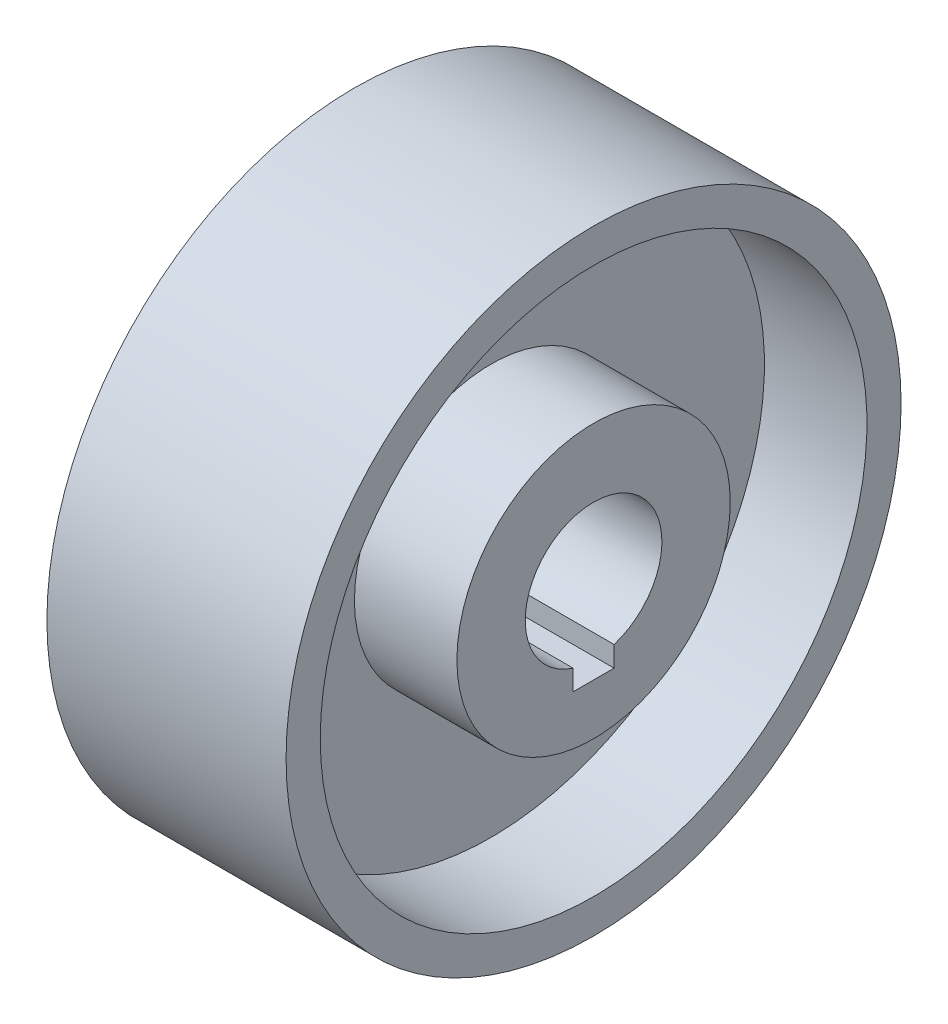
ISO-10303-21;
HEADER;
FILE_DESCRIPTION(('STEP AP214'),'2;1');
FILE_NAME('part.step','',(''),(''),'','','');
FILE_SCHEMA(('AUTOMOTIVE_DESIGN { 1 0 10303 214 1 1 1 1 }'));
ENDSEC;
DATA;
#1=APPLICATION_CONTEXT('core data for automotive mechanical design processes');
#2=APPLICATION_PROTOCOL_DEFINITION('international standard','automotive_design',2000,#1);
#3=PRODUCT_CONTEXT('',#1,'mechanical');
#4=PRODUCT('Part','Part','',(#3));
#5=PRODUCT_RELATED_PRODUCT_CATEGORY('part','',(#4));
#6=PRODUCT_DEFINITION_FORMATION('','',#4);
#7=PRODUCT_DEFINITION_CONTEXT('part definition',#1,'design');
#8=PRODUCT_DEFINITION('design','',#6,#7);
#9=PRODUCT_DEFINITION_SHAPE('','',#8);
#10=(LENGTH_UNIT() NAMED_UNIT(*) SI_UNIT(.MILLI.,.METRE.));
#11=(NAMED_UNIT(*) PLANE_ANGLE_UNIT() SI_UNIT($,.RADIAN.));
#12=(NAMED_UNIT(*) SI_UNIT($,.STERADIAN.) SOLID_ANGLE_UNIT());
#13=UNCERTAINTY_MEASURE_WITH_UNIT(LENGTH_MEASURE(1.E-05),#10,'distance_accuracy_value','');
#14=(GEOMETRIC_REPRESENTATION_CONTEXT(3) GLOBAL_UNCERTAINTY_ASSIGNED_CONTEXT((#13)) GLOBAL_UNIT_ASSIGNED_CONTEXT((#10,
#11,#12)) REPRESENTATION_CONTEXT('',''));
#15=CARTESIAN_POINT('',(0.,0.,0.));
#16=DIRECTION('',(0.,0.,1.));
#17=DIRECTION('',(1.,0.,0.));
#18=AXIS2_PLACEMENT_3D('',#15,#16,#17);
#19=CARTESIAN_POINT('',(-17.5,0.,-45.));
#20=DIRECTION('',(1.,0.,0.));
#21=DIRECTION('',(0.,0.,-1.));
#22=AXIS2_PLACEMENT_3D('',#19,#20,#21);
#23=PLANE('',#22);
#24=CARTESIAN_POINT('',(-17.5,0.,0.));
#25=DIRECTION('',(-1.,0.,0.));
#26=DIRECTION('',(0.,0.,1.));
#27=AXIS2_PLACEMENT_3D('',#24,#25,#26);
#28=CIRCLE('',#27,40.);
#29=CARTESIAN_POINT('',(-17.5,0.,40.));
#30=VERTEX_POINT('',#29);
#31=EDGE_CURVE('E11',#30,#30,#28,.T.);
#32=ORIENTED_EDGE('',*,*,#31,.F.);
#33=EDGE_LOOP('',(#32));
#34=FACE_BOUND('',#33,.T.);
#35=CARTESIAN_POINT('',(-17.5,0.,0.));
#36=DIRECTION('',(-1.,0.,0.));
#37=DIRECTION('',(0.,0.,1.));
#38=AXIS2_PLACEMENT_3D('',#35,#36,#37);
#39=CIRCLE('',#38,45.);
#40=CARTESIAN_POINT('',(-17.5,0.,45.));
#41=VERTEX_POINT('',#40);
#42=EDGE_CURVE('E84',#41,#41,#39,.T.);
#43=ORIENTED_EDGE('',*,*,#42,.T.);
#44=EDGE_LOOP('',(#43));
#45=FACE_BOUND('',#44,.T.);
#46=ADVANCED_FACE('F37',(#34,#45),#23,.F.);
#47=CARTESIAN_POINT('',(-42.0698329260567,0.,0.));
#48=DIRECTION('',(-1.,0.,0.));
#49=DIRECTION('',(0.,0.,1.));
#50=AXIS2_PLACEMENT_3D('',#47,#48,#49);
#51=CYLINDRICAL_SURFACE('',#50,40.);
#52=CARTESIAN_POINT('',(-2.50000000000001,0.,0.));
#53=DIRECTION('',(-1.,0.,0.));
#54=DIRECTION('',(0.,0.,1.));
#55=AXIS2_PLACEMENT_3D('',#52,#53,#54);
#56=CIRCLE('',#55,40.);
#57=CARTESIAN_POINT('',(-2.50000000000001,0.,40.));
#58=VERTEX_POINT('',#57);
#59=EDGE_CURVE('E44',#58,#58,#56,.T.);
#60=ORIENTED_EDGE('',*,*,#59,.F.);
#61=EDGE_LOOP('',(#60));
#62=FACE_BOUND('',#61,.T.);
#63=ORIENTED_EDGE('',*,*,#31,.T.);
#64=EDGE_LOOP('',(#63));
#65=FACE_BOUND('',#64,.T.);
#66=ADVANCED_FACE('F113',(#62,#65),#51,.F.);
#67=CARTESIAN_POINT('',(-2.50000000000001,0.,-40.));
#68=DIRECTION('',(1.,0.,0.));
#69=DIRECTION('',(0.,0.,-1.));
#70=AXIS2_PLACEMENT_3D('',#67,#68,#69);
#71=PLANE('',#70);
#72=CARTESIAN_POINT('',(-2.5,0.,0.));
#73=DIRECTION('',(-1.,0.,0.));
#74=DIRECTION('',(0.,0.,1.));
#75=AXIS2_PLACEMENT_3D('',#72,#73,#74);
#76=CIRCLE('',#75,20.);
#77=CARTESIAN_POINT('',(-2.5,0.,20.));
#78=VERTEX_POINT('',#77);
#79=EDGE_CURVE('E101',#78,#78,#76,.T.);
#80=ORIENTED_EDGE('',*,*,#79,.F.);
#81=EDGE_LOOP('',(#80));
#82=FACE_BOUND('',#81,.T.);
#83=ORIENTED_EDGE('',*,*,#59,.T.);
#84=EDGE_LOOP('',(#83));
#85=FACE_BOUND('',#84,.T.);
#86=ADVANCED_FACE('F111',(#82,#85),#71,.F.);
#87=CARTESIAN_POINT('',(-42.0698329260567,0.,0.));
#88=DIRECTION('',(-1.,0.,0.));
#89=DIRECTION('',(0.,0.,1.));
#90=AXIS2_PLACEMENT_3D('',#87,#88,#89);
#91=CYLINDRICAL_SURFACE('',#90,20.);
#92=CARTESIAN_POINT('',(-17.5,0.,0.));
#93=DIRECTION('',(-1.,0.,0.));
#94=DIRECTION('',(0.,0.,1.));
#95=AXIS2_PLACEMENT_3D('',#92,#93,#94);
#96=CIRCLE('',#95,20.);
#97=CARTESIAN_POINT('',(-17.5,0.,20.));
#98=VERTEX_POINT('',#97);
#99=EDGE_CURVE('E98',#98,#98,#96,.T.);
#100=ORIENTED_EDGE('',*,*,#99,.F.);
#101=EDGE_LOOP('',(#100));
#102=FACE_BOUND('',#101,.T.);
#103=ORIENTED_EDGE('',*,*,#79,.T.);
#104=EDGE_LOOP('',(#103));
#105=FACE_BOUND('',#104,.T.);
#106=ADVANCED_FACE('F194',(#102,#105),#91,.T.);
#107=CARTESIAN_POINT('',(-17.5,0.,-20.));
#108=DIRECTION('',(1.,0.,0.));
#109=DIRECTION('',(0.,0.,-1.));
#110=AXIS2_PLACEMENT_3D('',#107,#108,#109);
#111=PLANE('',#110);
#112=DIRECTION('',(0.,0.,1.));
#113=VECTOR('',#112,1.);
#114=CARTESIAN_POINT('',(-17.5,-12.5393920141695,3.));
#115=LINE('',#114,#113);
#116=CARTESIAN_POINT('',(-17.5,-12.5393920141695,-3.));
#117=VERTEX_POINT('',#116);
#118=CARTESIAN_POINT('',(-17.5,-12.5393920141695,3.));
#119=VERTEX_POINT('',#118);
#120=EDGE_CURVE('E152',#117,#119,#115,.T.);
#121=ORIENTED_EDGE('',*,*,#120,.F.);
#122=DIRECTION('',(0.,-1.,0.));
#123=VECTOR('',#122,1.);
#124=CARTESIAN_POINT('',(-17.5,-12.5393920141695,-3.));
#125=LINE('',#124,#123);
#126=CARTESIAN_POINT('',(-17.5,-9.53939201416946,-3.));
#127=VERTEX_POINT('',#126);
#128=EDGE_CURVE('E97',#127,#117,#125,.T.);
#129=ORIENTED_EDGE('',*,*,#128,.F.);
#130=CARTESIAN_POINT('',(-17.5,0.,0.));
#131=DIRECTION('',(-1.,0.,0.));
#132=DIRECTION('',(0.,0.,1.));
#133=AXIS2_PLACEMENT_3D('',#130,#131,#132);
#134=CIRCLE('',#133,10.);
#135=CARTESIAN_POINT('',(-17.5,-9.53939201416946,3.));
#136=VERTEX_POINT('',#135);
#137=EDGE_CURVE('E90',#136,#127,#134,.T.);
#138=ORIENTED_EDGE('',*,*,#137,.F.);
#139=DIRECTION('',(0.,1.,0.));
#140=VECTOR('',#139,1.);
#141=CARTESIAN_POINT('',(-17.5,-9.53939201416946,3.));
#142=LINE('',#141,#140);
#143=EDGE_CURVE('E77',#119,#136,#142,.T.);
#144=ORIENTED_EDGE('',*,*,#143,.F.);
#145=EDGE_LOOP('',(#121,#129,#138,#144));
#146=FACE_BOUND('',#145,.T.);
#147=ORIENTED_EDGE('',*,*,#99,.T.);
#148=EDGE_LOOP('',(#147));
#149=FACE_BOUND('',#148,.T.);
#150=ADVANCED_FACE('F95',(#146,#149),#111,.F.);
#151=CARTESIAN_POINT('',(-42.0698329260567,0.,0.));
#152=DIRECTION('',(-1.,0.,0.));
#153=DIRECTION('',(0.,0.,1.));
#154=AXIS2_PLACEMENT_3D('',#151,#152,#153);
#155=CYLINDRICAL_SURFACE('',#154,10.);
#156=ORIENTED_EDGE('',*,*,#137,.T.);
#157=DIRECTION('',(1.,0.,0.));
#158=VECTOR('',#157,1.);
#159=CARTESIAN_POINT('',(-17.501,-9.53939201416946,-3.));
#160=LINE('',#159,#158);
#161=CARTESIAN_POINT('',(17.5,-9.53939201416946,-3.));
#162=VERTEX_POINT('',#161);
#163=EDGE_CURVE('E59',#127,#162,#160,.T.);
#164=ORIENTED_EDGE('',*,*,#163,.T.);
#165=CARTESIAN_POINT('',(17.5,0.,0.));
#166=DIRECTION('',(-1.,0.,0.));
#167=DIRECTION('',(0.,0.,1.));
#168=AXIS2_PLACEMENT_3D('',#165,#166,#167);
#169=CIRCLE('',#168,10.);
#170=CARTESIAN_POINT('',(17.5,-9.53939201416946,3.));
#171=VERTEX_POINT('',#170);
#172=EDGE_CURVE('E92',#171,#162,#169,.T.);
#173=ORIENTED_EDGE('',*,*,#172,.F.);
#174=DIRECTION('',(1.,0.,0.));
#175=VECTOR('',#174,1.);
#176=CARTESIAN_POINT('',(-17.501,-9.53939201416946,3.));
#177=LINE('',#176,#175);
#178=EDGE_CURVE('E51',#136,#171,#177,.T.);
#179=ORIENTED_EDGE('',*,*,#178,.F.);
#180=EDGE_LOOP('',(#156,#164,#173,#179));
#181=FACE_BOUND('',#180,.T.);
#182=ADVANCED_FACE('F89',(#181),#155,.F.);
#183=CARTESIAN_POINT('',(17.5,0.,-20.));
#184=DIRECTION('',(-1.,0.,0.));
#185=DIRECTION('',(0.,0.,1.));
#186=AXIS2_PLACEMENT_3D('',#183,#184,#185);
#187=PLANE('',#186);
#188=CARTESIAN_POINT('',(17.5,0.,0.));
#189=DIRECTION('',(-1.,0.,0.));
#190=DIRECTION('',(0.,0.,1.));
#191=AXIS2_PLACEMENT_3D('',#188,#189,#190);
#192=CIRCLE('',#191,20.);
#193=CARTESIAN_POINT('',(17.5,0.,20.));
#194=VERTEX_POINT('',#193);
#195=EDGE_CURVE('E103',#194,#194,#192,.T.);
#196=ORIENTED_EDGE('',*,*,#195,.F.);
#197=EDGE_LOOP('',(#196));
#198=FACE_BOUND('',#197,.T.);
#199=ORIENTED_EDGE('',*,*,#172,.T.);
#200=DIRECTION('',(0.,1.,0.));
#201=VECTOR('',#200,1.);
#202=CARTESIAN_POINT('',(17.5,-12.5393920141695,-3.));
#203=LINE('',#202,#201);
#204=CARTESIAN_POINT('',(17.5,-12.5393920141695,-3.));
#205=VERTEX_POINT('',#204);
#206=EDGE_CURVE('E93',#205,#162,#203,.T.);
#207=ORIENTED_EDGE('',*,*,#206,.F.);
#208=DIRECTION('',(0.,0.,-1.));
#209=VECTOR('',#208,1.);
#210=CARTESIAN_POINT('',(17.5,-12.5393920141695,3.));
#211=LINE('',#210,#209);
#212=CARTESIAN_POINT('',(17.5,-12.5393920141695,3.));
#213=VERTEX_POINT('',#212);
#214=EDGE_CURVE('E149',#213,#205,#211,.T.);
#215=ORIENTED_EDGE('',*,*,#214,.F.);
#216=DIRECTION('',(0.,-1.,0.));
#217=VECTOR('',#216,1.);
#218=CARTESIAN_POINT('',(17.5,-9.53939201416946,3.));
#219=LINE('',#218,#217);
#220=EDGE_CURVE('E147',#171,#213,#219,.T.);
#221=ORIENTED_EDGE('',*,*,#220,.F.);
#222=EDGE_LOOP('',(#199,#207,#215,#221));
#223=FACE_BOUND('',#222,.T.);
#224=ADVANCED_FACE('F141',(#198,#223),#187,.F.);
#225=CARTESIAN_POINT('',(-42.0698329260567,0.,0.));
#226=DIRECTION('',(-1.,0.,0.));
#227=DIRECTION('',(0.,0.,1.));
#228=AXIS2_PLACEMENT_3D('',#225,#226,#227);
#229=CYLINDRICAL_SURFACE('',#228,20.);
#230=CARTESIAN_POINT('',(2.5,0.,0.));
#231=DIRECTION('',(-1.,0.,0.));
#232=DIRECTION('',(0.,0.,1.));
#233=AXIS2_PLACEMENT_3D('',#230,#231,#232);
#234=CIRCLE('',#233,20.);
#235=CARTESIAN_POINT('',(2.5,0.,20.));
#236=VERTEX_POINT('',#235);
#237=EDGE_CURVE('E134',#236,#236,#234,.T.);
#238=ORIENTED_EDGE('',*,*,#237,.F.);
#239=EDGE_LOOP('',(#238));
#240=FACE_BOUND('',#239,.T.);
#241=ORIENTED_EDGE('',*,*,#195,.T.);
#242=EDGE_LOOP('',(#241));
#243=FACE_BOUND('',#242,.T.);
#244=ADVANCED_FACE('F139',(#240,#243),#229,.T.);
#245=CARTESIAN_POINT('',(2.49999999999999,0.,-40.));
#246=DIRECTION('',(-1.,0.,0.));
#247=DIRECTION('',(0.,0.,1.));
#248=AXIS2_PLACEMENT_3D('',#245,#246,#247);
#249=PLANE('',#248);
#250=CARTESIAN_POINT('',(2.49999999999999,0.,0.));
#251=DIRECTION('',(-1.,0.,0.));
#252=DIRECTION('',(0.,0.,1.));
#253=AXIS2_PLACEMENT_3D('',#250,#251,#252);
#254=CIRCLE('',#253,40.);
#255=CARTESIAN_POINT('',(2.49999999999999,0.,40.));
#256=VERTEX_POINT('',#255);
#257=EDGE_CURVE('E131',#256,#256,#254,.T.);
#258=ORIENTED_EDGE('',*,*,#257,.F.);
#259=EDGE_LOOP('',(#258));
#260=FACE_BOUND('',#259,.T.);
#261=ORIENTED_EDGE('',*,*,#237,.T.);
#262=EDGE_LOOP('',(#261));
#263=FACE_BOUND('',#262,.T.);
#264=ADVANCED_FACE('F182',(#260,#263),#249,.F.);
#265=CARTESIAN_POINT('',(-42.0698329260567,0.,0.));
#266=DIRECTION('',(-1.,0.,0.));
#267=DIRECTION('',(0.,0.,1.));
#268=AXIS2_PLACEMENT_3D('',#265,#266,#267);
#269=CYLINDRICAL_SURFACE('',#268,40.);
#270=CARTESIAN_POINT('',(17.5,0.,0.));
#271=DIRECTION('',(-1.,0.,0.));
#272=DIRECTION('',(0.,0.,1.));
#273=AXIS2_PLACEMENT_3D('',#270,#271,#272);
#274=CIRCLE('',#273,40.);
#275=CARTESIAN_POINT('',(17.5,0.,40.));
#276=VERTEX_POINT('',#275);
#277=EDGE_CURVE('E126',#276,#276,#274,.T.);
#278=ORIENTED_EDGE('',*,*,#277,.F.);
#279=EDGE_LOOP('',(#278));
#280=FACE_BOUND('',#279,.T.);
#281=ORIENTED_EDGE('',*,*,#257,.T.);
#282=EDGE_LOOP('',(#281));
#283=FACE_BOUND('',#282,.T.);
#284=ADVANCED_FACE('F178',(#280,#283),#269,.F.);
#285=CARTESIAN_POINT('',(17.5,0.,-45.));
#286=DIRECTION('',(-1.,0.,0.));
#287=DIRECTION('',(0.,0.,1.));
#288=AXIS2_PLACEMENT_3D('',#285,#286,#287);
#289=PLANE('',#288);
#290=CARTESIAN_POINT('',(17.5,0.,0.));
#291=DIRECTION('',(-1.,0.,0.));
#292=DIRECTION('',(0.,0.,1.));
#293=AXIS2_PLACEMENT_3D('',#290,#291,#292);
#294=CIRCLE('',#293,45.);
#295=CARTESIAN_POINT('',(17.5,0.,45.));
#296=VERTEX_POINT('',#295);
#297=EDGE_CURVE('E123',#296,#296,#294,.T.);
#298=ORIENTED_EDGE('',*,*,#297,.F.);
#299=EDGE_LOOP('',(#298));
#300=FACE_BOUND('',#299,.T.);
#301=ORIENTED_EDGE('',*,*,#277,.T.);
#302=EDGE_LOOP('',(#301));
#303=FACE_BOUND('',#302,.T.);
#304=ADVANCED_FACE('F171',(#300,#303),#289,.F.);
#305=CARTESIAN_POINT('',(-42.0698329260567,0.,0.));
#306=DIRECTION('',(-1.,0.,0.));
#307=DIRECTION('',(0.,0.,1.));
#308=AXIS2_PLACEMENT_3D('',#305,#306,#307);
#309=CYLINDRICAL_SURFACE('',#308,45.);
#310=ORIENTED_EDGE('',*,*,#42,.F.);
#311=EDGE_LOOP('',(#310));
#312=FACE_BOUND('',#311,.T.);
#313=ORIENTED_EDGE('',*,*,#297,.T.);
#314=EDGE_LOOP('',(#313));
#315=FACE_BOUND('',#314,.T.);
#316=ADVANCED_FACE('F164',(#312,#315),#309,.T.);
#317=CARTESIAN_POINT('',(-17.501,-12.5393920141695,-3.));
#318=DIRECTION('',(0.,0.,-1.));
#319=DIRECTION('',(-1.,0.,0.));
#320=AXIS2_PLACEMENT_3D('',#317,#318,#319);
#321=PLANE('',#320);
#322=ORIENTED_EDGE('',*,*,#128,.T.);
#323=DIRECTION('',(1.,0.,0.));
#324=VECTOR('',#323,1.);
#325=CARTESIAN_POINT('',(-17.501,-12.5393920141695,-3.));
#326=LINE('',#325,#324);
#327=EDGE_CURVE('E158',#117,#205,#326,.T.);
#328=ORIENTED_EDGE('',*,*,#327,.T.);
#329=ORIENTED_EDGE('',*,*,#206,.T.);
#330=ORIENTED_EDGE('',*,*,#163,.F.);
#331=EDGE_LOOP('',(#322,#328,#329,#330));
#332=FACE_BOUND('',#331,.T.);
#333=ADVANCED_FACE('F162',(#332),#321,.F.);
#334=CARTESIAN_POINT('',(-17.501,-12.5393920141695,3.));
#335=DIRECTION('',(0.,-1.,0.));
#336=DIRECTION('',(0.,0.,-1.));
#337=AXIS2_PLACEMENT_3D('',#334,#335,#336);
#338=PLANE('',#337);
#339=ORIENTED_EDGE('',*,*,#120,.T.);
#340=DIRECTION('',(1.,0.,0.));
#341=VECTOR('',#340,1.);
#342=CARTESIAN_POINT('',(-17.501,-12.5393920141695,3.));
#343=LINE('',#342,#341);
#344=EDGE_CURVE('E79',#119,#213,#343,.T.);
#345=ORIENTED_EDGE('',*,*,#344,.T.);
#346=ORIENTED_EDGE('',*,*,#214,.T.);
#347=ORIENTED_EDGE('',*,*,#327,.F.);
#348=EDGE_LOOP('',(#339,#345,#346,#347));
#349=FACE_BOUND('',#348,.T.);
#350=ADVANCED_FACE('F161',(#349),#338,.F.);
#351=CARTESIAN_POINT('',(-17.501,-9.53939201416946,3.));
#352=DIRECTION('',(0.,0.,1.));
#353=DIRECTION('',(1.,0.,0.));
#354=AXIS2_PLACEMENT_3D('',#351,#352,#353);
#355=PLANE('',#354);
#356=ORIENTED_EDGE('',*,*,#143,.T.);
#357=ORIENTED_EDGE('',*,*,#178,.T.);
#358=ORIENTED_EDGE('',*,*,#220,.T.);
#359=ORIENTED_EDGE('',*,*,#344,.F.);
#360=EDGE_LOOP('',(#356,#357,#358,#359));
#361=FACE_BOUND('',#360,.T.);
#362=ADVANCED_FACE('F78',(#361),#355,.F.);
#363=CLOSED_SHELL('',(#46,#66,#86,#106,#150,#182,#224,#244,#264,#284,#304,#316,#333,#350,#362));
#364=MANIFOLD_SOLID_BREP('B2',#363);
#365=ADVANCED_BREP_SHAPE_REPRESENTATION('',(#18,#364),#14);
#366=SHAPE_DEFINITION_REPRESENTATION(#9,#365);
ENDSEC;
END-ISO-10303-21;
